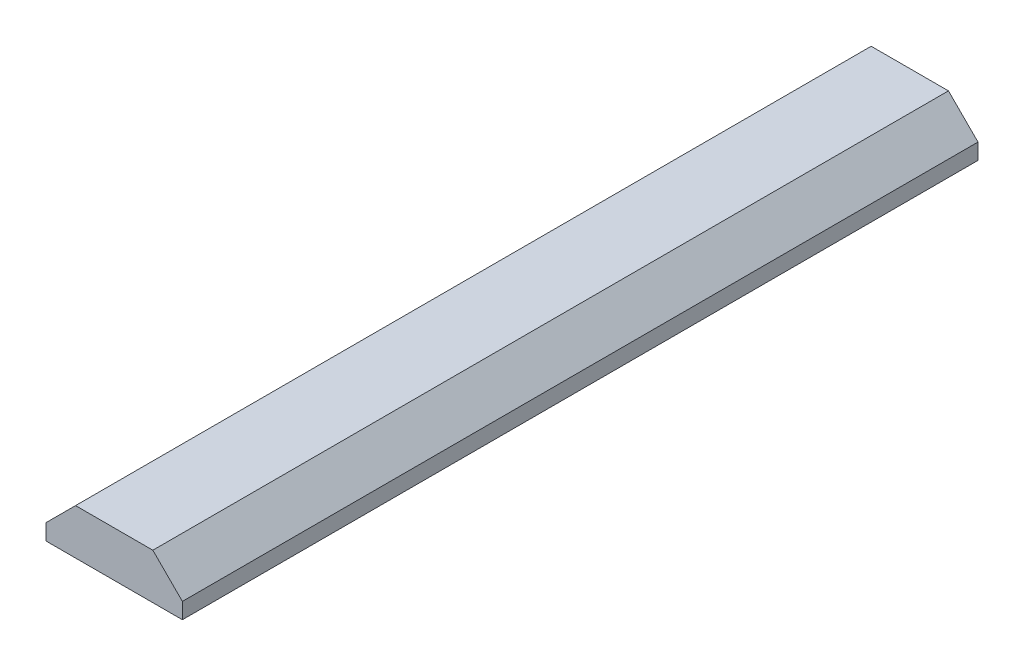
ISO-10303-21;
HEADER;
FILE_DESCRIPTION(('STEP AP214'),'2;1');
FILE_NAME('part.step','',(''),(''),'','','');
FILE_SCHEMA(('AUTOMOTIVE_DESIGN { 1 0 10303 214 1 1 1 1 }'));
ENDSEC;
DATA;
#1=APPLICATION_CONTEXT('core data for automotive mechanical design processes');
#2=APPLICATION_PROTOCOL_DEFINITION('international standard','automotive_design',2000,#1);
#3=PRODUCT_CONTEXT('',#1,'mechanical');
#4=PRODUCT('Part','Part','',(#3));
#5=PRODUCT_RELATED_PRODUCT_CATEGORY('part','',(#4));
#6=PRODUCT_DEFINITION_FORMATION('','',#4);
#7=PRODUCT_DEFINITION_CONTEXT('part definition',#1,'design');
#8=PRODUCT_DEFINITION('design','',#6,#7);
#9=PRODUCT_DEFINITION_SHAPE('','',#8);
#10=(LENGTH_UNIT() NAMED_UNIT(*) SI_UNIT(.MILLI.,.METRE.));
#11=(NAMED_UNIT(*) PLANE_ANGLE_UNIT() SI_UNIT($,.RADIAN.));
#12=(NAMED_UNIT(*) SI_UNIT($,.STERADIAN.) SOLID_ANGLE_UNIT());
#13=UNCERTAINTY_MEASURE_WITH_UNIT(LENGTH_MEASURE(1.E-05),#10,'distance_accuracy_value','');
#14=(GEOMETRIC_REPRESENTATION_CONTEXT(3) GLOBAL_UNCERTAINTY_ASSIGNED_CONTEXT((#13)) GLOBAL_UNIT_ASSIGNED_CONTEXT((#10,
#11,#12)) REPRESENTATION_CONTEXT('',''));
#15=CARTESIAN_POINT('',(0.,0.,0.));
#16=DIRECTION('',(0.,0.,1.));
#17=DIRECTION('',(1.,0.,0.));
#18=AXIS2_PLACEMENT_3D('',#15,#16,#17);
#19=CARTESIAN_POINT('',(3.4,1.80885878693797,70.));
#20=DIRECTION('',(0.707106781186549,0.707106781186546,0.));
#21=DIRECTION('',(-0.707106781186546,0.707106781186549,0.));
#22=AXIS2_PLACEMENT_3D('',#19,#20,#21);
#23=PLANE('',#22);
#24=DIRECTION('',(0.707106781186546,-0.707106781186549,0.));
#25=VECTOR('',#24,1.);
#26=CARTESIAN_POINT('',(3.4,1.80885878693797,0.));
#27=LINE('',#26,#25);
#28=CARTESIAN_POINT('',(3.4,1.80885878693797,0.));
#29=VERTEX_POINT('',#28);
#30=CARTESIAN_POINT('',(6.,-0.791141213062042,0.));
#31=VERTEX_POINT('',#30);
#32=EDGE_CURVE('E127',#29,#31,#27,.T.);
#33=ORIENTED_EDGE('',*,*,#32,.F.);
#34=DIRECTION('',(0.,0.,-1.));
#35=VECTOR('',#34,1.);
#36=CARTESIAN_POINT('',(3.4,1.80885878693797,70.));
#37=LINE('',#36,#35);
#38=CARTESIAN_POINT('',(3.4,1.80885878693797,70.));
#39=VERTEX_POINT('',#38);
#40=EDGE_CURVE('E11',#39,#29,#37,.T.);
#41=ORIENTED_EDGE('',*,*,#40,.F.);
#42=DIRECTION('',(0.707106781186546,-0.707106781186549,0.));
#43=VECTOR('',#42,1.);
#44=CARTESIAN_POINT('',(3.4,1.80885878693797,70.));
#45=LINE('',#44,#43);
#46=CARTESIAN_POINT('',(6.,-0.791141213062042,70.));
#47=VERTEX_POINT('',#46);
#48=EDGE_CURVE('E139',#39,#47,#45,.T.);
#49=ORIENTED_EDGE('',*,*,#48,.T.);
#50=DIRECTION('',(0.,0.,-1.));
#51=VECTOR('',#50,1.);
#52=CARTESIAN_POINT('',(6.,-0.791141213062042,70.));
#53=LINE('',#52,#51);
#54=EDGE_CURVE('E44',#47,#31,#53,.T.);
#55=ORIENTED_EDGE('',*,*,#54,.T.);
#56=EDGE_LOOP('',(#33,#41,#49,#55));
#57=FACE_BOUND('',#56,.T.);
#58=ADVANCED_FACE('F41',(#57),#23,.T.);
#59=CARTESIAN_POINT('',(3.4,1.80885878693797,70.));
#60=DIRECTION('',(0.,-1.,0.));
#61=DIRECTION('',(0.,0.,-1.));
#62=AXIS2_PLACEMENT_3D('',#59,#60,#61);
#63=PLANE('',#62);
#64=DIRECTION('',(-1.,0.,0.));
#65=VECTOR('',#64,1.);
#66=CARTESIAN_POINT('',(3.4,1.80885878693797,0.));
#67=LINE('',#66,#65);
#68=CARTESIAN_POINT('',(-3.4,1.80885878693797,0.));
#69=VERTEX_POINT('',#68);
#70=EDGE_CURVE('E80',#29,#69,#67,.T.);
#71=ORIENTED_EDGE('',*,*,#70,.T.);
#72=DIRECTION('',(0.,0.,-1.));
#73=VECTOR('',#72,1.);
#74=CARTESIAN_POINT('',(-3.4,1.80885878693797,70.));
#75=LINE('',#74,#73);
#76=CARTESIAN_POINT('',(-3.4,1.80885878693797,70.));
#77=VERTEX_POINT('',#76);
#78=EDGE_CURVE('E50',#77,#69,#75,.T.);
#79=ORIENTED_EDGE('',*,*,#78,.F.);
#80=DIRECTION('',(-1.,0.,0.));
#81=VECTOR('',#80,1.);
#82=CARTESIAN_POINT('',(3.4,1.80885878693797,70.));
#83=LINE('',#82,#81);
#84=EDGE_CURVE('E105',#39,#77,#83,.T.);
#85=ORIENTED_EDGE('',*,*,#84,.F.);
#86=ORIENTED_EDGE('',*,*,#40,.T.);
#87=EDGE_LOOP('',(#71,#79,#85,#86));
#88=FACE_BOUND('',#87,.T.);
#89=ADVANCED_FACE('F159',(#88),#63,.F.);
#90=CARTESIAN_POINT('',(-3.4,1.80885878693797,70.));
#91=DIRECTION('',(0.707106781186549,-0.707106781186546,0.));
#92=DIRECTION('',(0.707106781186546,0.707106781186549,0.));
#93=AXIS2_PLACEMENT_3D('',#90,#91,#92);
#94=PLANE('',#93);
#95=DIRECTION('',(-0.707106781186546,-0.707106781186549,0.));
#96=VECTOR('',#95,1.);
#97=CARTESIAN_POINT('',(-3.4,1.80885878693797,0.));
#98=LINE('',#97,#96);
#99=CARTESIAN_POINT('',(-6.,-0.791141213062042,0.));
#100=VERTEX_POINT('',#99);
#101=EDGE_CURVE('E112',#69,#100,#98,.T.);
#102=ORIENTED_EDGE('',*,*,#101,.T.);
#103=DIRECTION('',(0.,0.,-1.));
#104=VECTOR('',#103,1.);
#105=CARTESIAN_POINT('',(-6.,-0.791141213062042,70.));
#106=LINE('',#105,#104);
#107=CARTESIAN_POINT('',(-6.,-0.791141213062042,70.));
#108=VERTEX_POINT('',#107);
#109=EDGE_CURVE('E109',#108,#100,#106,.T.);
#110=ORIENTED_EDGE('',*,*,#109,.F.);
#111=DIRECTION('',(-0.707106781186546,-0.707106781186549,0.));
#112=VECTOR('',#111,1.);
#113=CARTESIAN_POINT('',(-3.4,1.80885878693797,70.));
#114=LINE('',#113,#112);
#115=EDGE_CURVE('E98',#77,#108,#114,.T.);
#116=ORIENTED_EDGE('',*,*,#115,.F.);
#117=ORIENTED_EDGE('',*,*,#78,.T.);
#118=EDGE_LOOP('',(#102,#110,#116,#117));
#119=FACE_BOUND('',#118,.T.);
#120=ADVANCED_FACE('F110',(#119),#94,.F.);
#121=CARTESIAN_POINT('',(-6.,-0.791141213062042,70.));
#122=DIRECTION('',(1.,0.,0.));
#123=DIRECTION('',(0.,0.,-1.));
#124=AXIS2_PLACEMENT_3D('',#121,#122,#123);
#125=PLANE('',#124);
#126=DIRECTION('',(0.,-1.,0.));
#127=VECTOR('',#126,1.);
#128=CARTESIAN_POINT('',(-6.,-0.791141213062042,0.));
#129=LINE('',#128,#127);
#130=CARTESIAN_POINT('',(-6.,-2.19114121306203,0.));
#131=VERTEX_POINT('',#130);
#132=EDGE_CURVE('E136',#100,#131,#129,.T.);
#133=ORIENTED_EDGE('',*,*,#132,.T.);
#134=DIRECTION('',(0.,0.,-1.));
#135=VECTOR('',#134,1.);
#136=CARTESIAN_POINT('',(-6.,-2.19114121306203,70.));
#137=LINE('',#136,#135);
#138=CARTESIAN_POINT('',(-6.,-2.19114121306203,70.));
#139=VERTEX_POINT('',#138);
#140=EDGE_CURVE('E115',#139,#131,#137,.T.);
#141=ORIENTED_EDGE('',*,*,#140,.F.);
#142=DIRECTION('',(0.,-1.,0.));
#143=VECTOR('',#142,1.);
#144=CARTESIAN_POINT('',(-6.,-0.791141213062042,70.));
#145=LINE('',#144,#143);
#146=EDGE_CURVE('E103',#108,#139,#145,.T.);
#147=ORIENTED_EDGE('',*,*,#146,.F.);
#148=ORIENTED_EDGE('',*,*,#109,.T.);
#149=EDGE_LOOP('',(#133,#141,#147,#148));
#150=FACE_BOUND('',#149,.T.);
#151=ADVANCED_FACE('F117',(#150),#125,.F.);
#152=CARTESIAN_POINT('',(-6.,-2.19114121306203,70.));
#153=DIRECTION('',(0.,1.,0.));
#154=DIRECTION('',(0.,0.,1.));
#155=AXIS2_PLACEMENT_3D('',#152,#153,#154);
#156=PLANE('',#155);
#157=DIRECTION('',(1.,0.,0.));
#158=VECTOR('',#157,1.);
#159=CARTESIAN_POINT('',(-6.,-2.19114121306203,0.));
#160=LINE('',#159,#158);
#161=CARTESIAN_POINT('',(6.,-2.19114121306203,0.));
#162=VERTEX_POINT('',#161);
#163=EDGE_CURVE('E133',#131,#162,#160,.T.);
#164=ORIENTED_EDGE('',*,*,#163,.T.);
#165=DIRECTION('',(0.,0.,-1.));
#166=VECTOR('',#165,1.);
#167=CARTESIAN_POINT('',(6.,-2.19114121306203,70.));
#168=LINE('',#167,#166);
#169=CARTESIAN_POINT('',(6.,-2.19114121306203,70.));
#170=VERTEX_POINT('',#169);
#171=EDGE_CURVE('E142',#170,#162,#168,.T.);
#172=ORIENTED_EDGE('',*,*,#171,.F.);
#173=DIRECTION('',(1.,0.,0.));
#174=VECTOR('',#173,1.);
#175=CARTESIAN_POINT('',(-6.,-2.19114121306203,70.));
#176=LINE('',#175,#174);
#177=EDGE_CURVE('E120',#139,#170,#176,.T.);
#178=ORIENTED_EDGE('',*,*,#177,.F.);
#179=ORIENTED_EDGE('',*,*,#140,.T.);
#180=EDGE_LOOP('',(#164,#172,#178,#179));
#181=FACE_BOUND('',#180,.T.);
#182=ADVANCED_FACE('F149',(#181),#156,.F.);
#183=CARTESIAN_POINT('',(6.,-0.791141213062042,70.));
#184=DIRECTION('',(1.,0.,0.));
#185=DIRECTION('',(0.,0.,-1.));
#186=AXIS2_PLACEMENT_3D('',#183,#184,#185);
#187=PLANE('',#186);
#188=DIRECTION('',(0.,-1.,0.));
#189=VECTOR('',#188,1.);
#190=CARTESIAN_POINT('',(6.,-0.791141213062042,0.));
#191=LINE('',#190,#189);
#192=EDGE_CURVE('E130',#31,#162,#191,.T.);
#193=ORIENTED_EDGE('',*,*,#192,.F.);
#194=ORIENTED_EDGE('',*,*,#54,.F.);
#195=DIRECTION('',(0.,-1.,0.));
#196=VECTOR('',#195,1.);
#197=CARTESIAN_POINT('',(6.,-0.791141213062042,70.));
#198=LINE('',#197,#196);
#199=EDGE_CURVE('E122',#47,#170,#198,.T.);
#200=ORIENTED_EDGE('',*,*,#199,.T.);
#201=ORIENTED_EDGE('',*,*,#171,.T.);
#202=EDGE_LOOP('',(#193,#194,#200,#201));
#203=FACE_BOUND('',#202,.T.);
#204=ADVANCED_FACE('F144',(#203),#187,.T.);
#205=CARTESIAN_POINT('',(0.,0.,70.));
#206=DIRECTION('',(0.,0.,-1.));
#207=DIRECTION('',(-1.,0.,0.));
#208=AXIS2_PLACEMENT_3D('',#205,#206,#207);
#209=PLANE('',#208);
#210=ORIENTED_EDGE('',*,*,#48,.F.);
#211=ORIENTED_EDGE('',*,*,#84,.T.);
#212=ORIENTED_EDGE('',*,*,#115,.T.);
#213=ORIENTED_EDGE('',*,*,#146,.T.);
#214=ORIENTED_EDGE('',*,*,#177,.T.);
#215=ORIENTED_EDGE('',*,*,#199,.F.);
#216=EDGE_LOOP('',(#210,#211,#212,#213,#214,#215));
#217=FACE_BOUND('',#216,.T.);
#218=ADVANCED_FACE('F101',(#217),#209,.F.);
#219=CARTESIAN_POINT('',(0.,0.,0.));
#220=DIRECTION('',(0.,0.,-1.));
#221=DIRECTION('',(-1.,0.,0.));
#222=AXIS2_PLACEMENT_3D('',#219,#220,#221);
#223=PLANE('',#222);
#224=ORIENTED_EDGE('',*,*,#32,.T.);
#225=ORIENTED_EDGE('',*,*,#192,.T.);
#226=ORIENTED_EDGE('',*,*,#163,.F.);
#227=ORIENTED_EDGE('',*,*,#132,.F.);
#228=ORIENTED_EDGE('',*,*,#101,.F.);
#229=ORIENTED_EDGE('',*,*,#70,.F.);
#230=EDGE_LOOP('',(#224,#225,#226,#227,#228,#229));
#231=FACE_BOUND('',#230,.T.);
#232=ADVANCED_FACE('F147',(#231),#223,.T.);
#233=CLOSED_SHELL('',(#58,#89,#120,#151,#182,#204,#218,#232));
#234=MANIFOLD_SOLID_BREP('B2',#233);
#235=ADVANCED_BREP_SHAPE_REPRESENTATION('',(#18,#234),#14);
#236=SHAPE_DEFINITION_REPRESENTATION(#9,#235);
ENDSEC;
END-ISO-10303-21;
